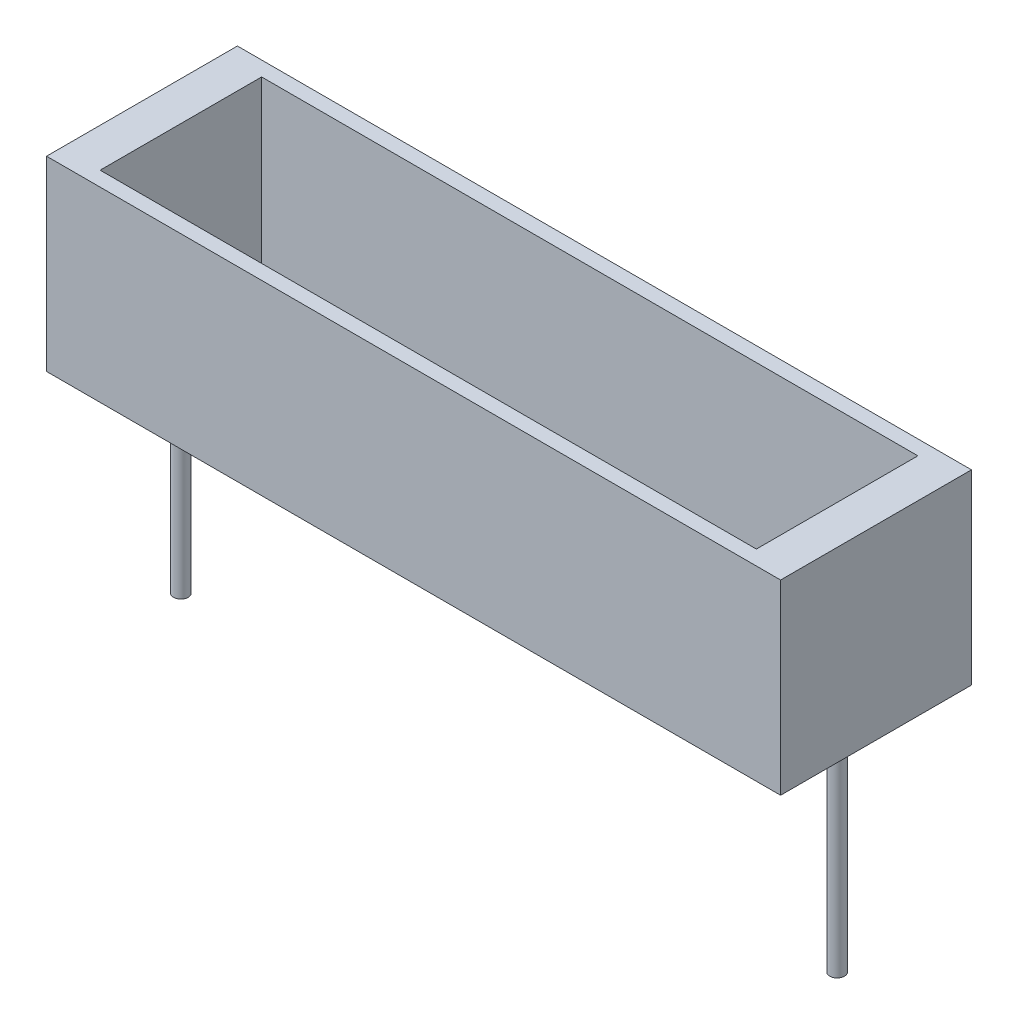
ISO-10303-21;
HEADER;
FILE_DESCRIPTION(('STEP AP214'),'2;1');
FILE_NAME('part.step','',(''),(''),'','','');
FILE_SCHEMA(('AUTOMOTIVE_DESIGN { 1 0 10303 214 1 1 1 1 }'));
ENDSEC;
DATA;
#1=APPLICATION_CONTEXT('core data for automotive mechanical design processes');
#2=APPLICATION_PROTOCOL_DEFINITION('international standard','automotive_design',2000,#1);
#3=PRODUCT_CONTEXT('',#1,'mechanical');
#4=PRODUCT('Part','Part','',(#3));
#5=PRODUCT_RELATED_PRODUCT_CATEGORY('part','',(#4));
#6=PRODUCT_DEFINITION_FORMATION('','',#4);
#7=PRODUCT_DEFINITION_CONTEXT('part definition',#1,'design');
#8=PRODUCT_DEFINITION('design','',#6,#7);
#9=PRODUCT_DEFINITION_SHAPE('','',#8);
#10=(LENGTH_UNIT() NAMED_UNIT(*) SI_UNIT(.MILLI.,.METRE.));
#11=(NAMED_UNIT(*) PLANE_ANGLE_UNIT() SI_UNIT($,.RADIAN.));
#12=(NAMED_UNIT(*) SI_UNIT($,.STERADIAN.) SOLID_ANGLE_UNIT());
#13=UNCERTAINTY_MEASURE_WITH_UNIT(LENGTH_MEASURE(1.E-05),#10,'distance_accuracy_value','');
#14=(GEOMETRIC_REPRESENTATION_CONTEXT(3) GLOBAL_UNCERTAINTY_ASSIGNED_CONTEXT((#13)) GLOBAL_UNIT_ASSIGNED_CONTEXT((#10,
#11,#12)) REPRESENTATION_CONTEXT('',''));
#15=CARTESIAN_POINT('',(0.,0.,0.));
#16=DIRECTION('',(0.,0.,1.));
#17=DIRECTION('',(1.,0.,0.));
#18=AXIS2_PLACEMENT_3D('',#15,#16,#17);
#19=CARTESIAN_POINT('',(-25.,0.,6.5));
#20=DIRECTION('',(0.,1.,0.));
#21=DIRECTION('',(0.,0.,1.));
#22=AXIS2_PLACEMENT_3D('',#19,#20,#21);
#23=PLANE('',#22);
#24=CARTESIAN_POINT('',(-22.35,0.,0.));
#25=DIRECTION('',(0.,1.,0.));
#26=DIRECTION('',(0.,0.,1.));
#27=AXIS2_PLACEMENT_3D('',#24,#25,#26);
#28=CIRCLE('',#27,0.499999999999999);
#29=CARTESIAN_POINT('',(-22.35,0.,0.499999999999999));
#30=VERTEX_POINT('',#29);
#31=EDGE_CURVE('E375',#30,#30,#28,.F.);
#32=ORIENTED_EDGE('',*,*,#31,.F.);
#33=EDGE_LOOP('',(#32));
#34=FACE_BOUND('',#33,.T.);
#35=DIRECTION('',(0.,0.,1.));
#36=VECTOR('',#35,1.);
#37=CARTESIAN_POINT('',(-25.,0.,-6.5));
#38=LINE('',#37,#36);
#39=CARTESIAN_POINT('',(-25.,0.,-6.5));
#40=VERTEX_POINT('',#39);
#41=CARTESIAN_POINT('',(-25.,0.,6.5));
#42=VERTEX_POINT('',#41);
#43=EDGE_CURVE('E470',#40,#42,#38,.T.);
#44=ORIENTED_EDGE('',*,*,#43,.F.);
#45=DIRECTION('',(-1.,0.,0.));
#46=VECTOR('',#45,1.);
#47=CARTESIAN_POINT('',(-25.,0.,-6.5));
#48=LINE('',#47,#46);
#49=CARTESIAN_POINT('',(25.,0.,-6.5));
#50=VERTEX_POINT('',#49);
#51=EDGE_CURVE('E479',#50,#40,#48,.T.);
#52=ORIENTED_EDGE('',*,*,#51,.F.);
#53=DIRECTION('',(0.,0.,-1.));
#54=VECTOR('',#53,1.);
#55=CARTESIAN_POINT('',(25.,0.,-6.5));
#56=LINE('',#55,#54);
#57=CARTESIAN_POINT('',(25.,0.,6.5));
#58=VERTEX_POINT('',#57);
#59=EDGE_CURVE('E477',#58,#50,#56,.T.);
#60=ORIENTED_EDGE('',*,*,#59,.F.);
#61=DIRECTION('',(1.,0.,0.));
#62=VECTOR('',#61,1.);
#63=CARTESIAN_POINT('',(-25.,0.,6.5));
#64=LINE('',#63,#62);
#65=EDGE_CURVE('E475',#42,#58,#64,.T.);
#66=ORIENTED_EDGE('',*,*,#65,.F.);
#67=EDGE_LOOP('',(#44,#52,#60,#66));
#68=FACE_BOUND('',#67,.T.);
#69=CARTESIAN_POINT('',(22.35,0.,0.));
#70=DIRECTION('',(0.,1.,0.));
#71=DIRECTION('',(0.,0.,1.));
#72=AXIS2_PLACEMENT_3D('',#69,#70,#71);
#73=CIRCLE('',#72,0.499999999999999);
#74=CARTESIAN_POINT('',(22.35,0.,0.499999999999999));
#75=VERTEX_POINT('',#74);
#76=EDGE_CURVE('E11',#75,#75,#73,.F.);
#77=ORIENTED_EDGE('',*,*,#76,.F.);
#78=EDGE_LOOP('',(#77));
#79=FACE_BOUND('',#78,.T.);
#80=ADVANCED_FACE('F367',(#34,#68,#79),#23,.F.);
#81=CARTESIAN_POINT('',(-25.,12.7,-6.5));
#82=DIRECTION('',(1.,0.,0.));
#83=DIRECTION('',(0.,0.,-1.));
#84=AXIS2_PLACEMENT_3D('',#81,#82,#83);
#85=PLANE('',#84);
#86=ORIENTED_EDGE('',*,*,#43,.T.);
#87=DIRECTION('',(0.,-1.,0.));
#88=VECTOR('',#87,1.);
#89=CARTESIAN_POINT('',(-25.,12.7,6.5));
#90=LINE('',#89,#88);
#91=CARTESIAN_POINT('',(-25.,12.7,6.5));
#92=VERTEX_POINT('',#91);
#93=EDGE_CURVE('E497',#92,#42,#90,.T.);
#94=ORIENTED_EDGE('',*,*,#93,.F.);
#95=DIRECTION('',(0.,0.,1.));
#96=VECTOR('',#95,1.);
#97=CARTESIAN_POINT('',(-25.,12.7,-6.5));
#98=LINE('',#97,#96);
#99=CARTESIAN_POINT('',(-25.,12.7,-6.5));
#100=VERTEX_POINT('',#99);
#101=EDGE_CURVE('E481',#100,#92,#98,.T.);
#102=ORIENTED_EDGE('',*,*,#101,.F.);
#103=DIRECTION('',(0.,-1.,0.));
#104=VECTOR('',#103,1.);
#105=CARTESIAN_POINT('',(-25.,12.7,-6.5));
#106=LINE('',#105,#104);
#107=EDGE_CURVE('E488',#100,#40,#106,.T.);
#108=ORIENTED_EDGE('',*,*,#107,.T.);
#109=EDGE_LOOP('',(#86,#94,#102,#108));
#110=FACE_BOUND('',#109,.T.);
#111=ADVANCED_FACE('F369',(#110),#85,.F.);
#112=CARTESIAN_POINT('',(-25.,12.7,6.5));
#113=DIRECTION('',(0.,0.,-1.));
#114=DIRECTION('',(-1.,0.,0.));
#115=AXIS2_PLACEMENT_3D('',#112,#113,#114);
#116=PLANE('',#115);
#117=ORIENTED_EDGE('',*,*,#65,.T.);
#118=DIRECTION('',(0.,-1.,0.));
#119=VECTOR('',#118,1.);
#120=CARTESIAN_POINT('',(25.,12.7,6.5));
#121=LINE('',#120,#119);
#122=CARTESIAN_POINT('',(25.,12.7,6.5));
#123=VERTEX_POINT('',#122);
#124=EDGE_CURVE('E494',#123,#58,#121,.T.);
#125=ORIENTED_EDGE('',*,*,#124,.F.);
#126=DIRECTION('',(1.,0.,0.));
#127=VECTOR('',#126,1.);
#128=CARTESIAN_POINT('',(-25.,12.7,6.5));
#129=LINE('',#128,#127);
#130=EDGE_CURVE('E483',#92,#123,#129,.T.);
#131=ORIENTED_EDGE('',*,*,#130,.F.);
#132=ORIENTED_EDGE('',*,*,#93,.T.);
#133=EDGE_LOOP('',(#117,#125,#131,#132));
#134=FACE_BOUND('',#133,.T.);
#135=ADVANCED_FACE('F554',(#134),#116,.F.);
#136=CARTESIAN_POINT('',(25.,12.7,-6.5));
#137=DIRECTION('',(-1.,0.,0.));
#138=DIRECTION('',(0.,0.,1.));
#139=AXIS2_PLACEMENT_3D('',#136,#137,#138);
#140=PLANE('',#139);
#141=ORIENTED_EDGE('',*,*,#59,.T.);
#142=DIRECTION('',(0.,-1.,0.));
#143=VECTOR('',#142,1.);
#144=CARTESIAN_POINT('',(25.,12.7,-6.5));
#145=LINE('',#144,#143);
#146=CARTESIAN_POINT('',(25.,12.7,-6.5));
#147=VERTEX_POINT('',#146);
#148=EDGE_CURVE('E491',#147,#50,#145,.T.);
#149=ORIENTED_EDGE('',*,*,#148,.F.);
#150=DIRECTION('',(0.,0.,-1.));
#151=VECTOR('',#150,1.);
#152=CARTESIAN_POINT('',(25.,12.7,-6.5));
#153=LINE('',#152,#151);
#154=EDGE_CURVE('E485',#123,#147,#153,.T.);
#155=ORIENTED_EDGE('',*,*,#154,.F.);
#156=ORIENTED_EDGE('',*,*,#124,.T.);
#157=EDGE_LOOP('',(#141,#149,#155,#156));
#158=FACE_BOUND('',#157,.T.);
#159=ADVANCED_FACE('F551',(#158),#140,.F.);
#160=CARTESIAN_POINT('',(-25.,12.7,-6.5));
#161=DIRECTION('',(0.,0.,1.));
#162=DIRECTION('',(1.,0.,0.));
#163=AXIS2_PLACEMENT_3D('',#160,#161,#162);
#164=PLANE('',#163);
#165=ORIENTED_EDGE('',*,*,#51,.T.);
#166=ORIENTED_EDGE('',*,*,#107,.F.);
#167=DIRECTION('',(-1.,0.,0.));
#168=VECTOR('',#167,1.);
#169=CARTESIAN_POINT('',(-25.,12.7,-6.5));
#170=LINE('',#169,#168);
#171=EDGE_CURVE('E390',#147,#100,#170,.T.);
#172=ORIENTED_EDGE('',*,*,#171,.F.);
#173=ORIENTED_EDGE('',*,*,#148,.T.);
#174=EDGE_LOOP('',(#165,#166,#172,#173));
#175=FACE_BOUND('',#174,.T.);
#176=ADVANCED_FACE('F548',(#175),#164,.F.);
#177=CARTESIAN_POINT('',(-25.,12.7,6.5));
#178=DIRECTION('',(0.,1.,0.));
#179=DIRECTION('',(0.,0.,1.));
#180=AXIS2_PLACEMENT_3D('',#177,#178,#179);
#181=PLANE('',#180);
#182=DIRECTION('',(0.,0.,-1.));
#183=VECTOR('',#182,1.);
#184=CARTESIAN_POINT('',(22.35,12.7,-5.5));
#185=LINE('',#184,#183);
#186=CARTESIAN_POINT('',(22.35,12.7,5.5));
#187=VERTEX_POINT('',#186);
#188=CARTESIAN_POINT('',(22.35,12.7,-5.5));
#189=VERTEX_POINT('',#188);
#190=EDGE_CURVE('E382',#187,#189,#185,.T.);
#191=ORIENTED_EDGE('',*,*,#190,.F.);
#192=DIRECTION('',(1.,0.,0.));
#193=VECTOR('',#192,1.);
#194=CARTESIAN_POINT('',(22.35,12.7,5.5));
#195=LINE('',#194,#193);
#196=CARTESIAN_POINT('',(-22.35,12.7,5.5));
#197=VERTEX_POINT('',#196);
#198=EDGE_CURVE('E454',#197,#187,#195,.T.);
#199=ORIENTED_EDGE('',*,*,#198,.F.);
#200=DIRECTION('',(0.,0.,1.));
#201=VECTOR('',#200,1.);
#202=CARTESIAN_POINT('',(-22.35,12.7,-5.5));
#203=LINE('',#202,#201);
#204=CARTESIAN_POINT('',(-22.35,12.7,-5.5));
#205=VERTEX_POINT('',#204);
#206=EDGE_CURVE('E437',#205,#197,#203,.T.);
#207=ORIENTED_EDGE('',*,*,#206,.F.);
#208=DIRECTION('',(-1.,0.,0.));
#209=VECTOR('',#208,1.);
#210=CARTESIAN_POINT('',(22.35,12.7,-5.5));
#211=LINE('',#210,#209);
#212=EDGE_CURVE('E448',#189,#205,#211,.T.);
#213=ORIENTED_EDGE('',*,*,#212,.F.);
#214=EDGE_LOOP('',(#191,#199,#207,#213));
#215=FACE_BOUND('',#214,.T.);
#216=ORIENTED_EDGE('',*,*,#101,.T.);
#217=ORIENTED_EDGE('',*,*,#130,.T.);
#218=ORIENTED_EDGE('',*,*,#154,.T.);
#219=ORIENTED_EDGE('',*,*,#171,.T.);
#220=EDGE_LOOP('',(#216,#217,#218,#219));
#221=FACE_BOUND('',#220,.T.);
#222=ADVANCED_FACE('F452',(#215,#221),#181,.T.);
#223=CARTESIAN_POINT('',(22.35,1.7,-5.5));
#224=DIRECTION('',(1.,0.,0.));
#225=DIRECTION('',(0.,0.,-1.));
#226=AXIS2_PLACEMENT_3D('',#223,#224,#225);
#227=PLANE('',#226);
#228=ORIENTED_EDGE('',*,*,#190,.T.);
#229=DIRECTION('',(0.,1.,0.));
#230=VECTOR('',#229,1.);
#231=CARTESIAN_POINT('',(22.35,1.7,-5.5));
#232=LINE('',#231,#230);
#233=CARTESIAN_POINT('',(22.35,1.7,-5.5));
#234=VERTEX_POINT('',#233);
#235=EDGE_CURVE('E445',#234,#189,#232,.T.);
#236=ORIENTED_EDGE('',*,*,#235,.F.);
#237=DIRECTION('',(0.,0.,-1.));
#238=VECTOR('',#237,1.);
#239=CARTESIAN_POINT('',(22.35,1.7,-5.5));
#240=LINE('',#239,#238);
#241=CARTESIAN_POINT('',(22.35,1.7,5.5));
#242=VERTEX_POINT('',#241);
#243=EDGE_CURVE('E456',#242,#234,#240,.T.);
#244=ORIENTED_EDGE('',*,*,#243,.F.);
#245=DIRECTION('',(0.,1.,0.));
#246=VECTOR('',#245,1.);
#247=CARTESIAN_POINT('',(22.35,1.7,5.5));
#248=LINE('',#247,#246);
#249=EDGE_CURVE('E468',#242,#187,#248,.T.);
#250=ORIENTED_EDGE('',*,*,#249,.T.);
#251=EDGE_LOOP('',(#228,#236,#244,#250));
#252=FACE_BOUND('',#251,.T.);
#253=ADVANCED_FACE('F538',(#252),#227,.F.);
#254=CARTESIAN_POINT('',(22.35,1.7,5.5));
#255=DIRECTION('',(0.,0.,1.));
#256=DIRECTION('',(1.,0.,0.));
#257=AXIS2_PLACEMENT_3D('',#254,#255,#256);
#258=PLANE('',#257);
#259=ORIENTED_EDGE('',*,*,#198,.T.);
#260=ORIENTED_EDGE('',*,*,#249,.F.);
#261=DIRECTION('',(1.,0.,0.));
#262=VECTOR('',#261,1.);
#263=CARTESIAN_POINT('',(22.35,1.7,5.5));
#264=LINE('',#263,#262);
#265=CARTESIAN_POINT('',(-22.35,1.7,5.5));
#266=VERTEX_POINT('',#265);
#267=EDGE_CURVE('E465',#266,#242,#264,.T.);
#268=ORIENTED_EDGE('',*,*,#267,.F.);
#269=DIRECTION('',(0.,1.,0.));
#270=VECTOR('',#269,1.);
#271=CARTESIAN_POINT('',(-22.35,1.7,5.5));
#272=LINE('',#271,#270);
#273=EDGE_CURVE('E444',#266,#197,#272,.T.);
#274=ORIENTED_EDGE('',*,*,#273,.T.);
#275=EDGE_LOOP('',(#259,#260,#268,#274));
#276=FACE_BOUND('',#275,.T.);
#277=ADVANCED_FACE('F535',(#276),#258,.F.);
#278=CARTESIAN_POINT('',(-22.35,1.7,-5.5));
#279=DIRECTION('',(-1.,0.,0.));
#280=DIRECTION('',(0.,0.,1.));
#281=AXIS2_PLACEMENT_3D('',#278,#279,#280);
#282=PLANE('',#281);
#283=ORIENTED_EDGE('',*,*,#206,.T.);
#284=ORIENTED_EDGE('',*,*,#273,.F.);
#285=DIRECTION('',(0.,0.,1.));
#286=VECTOR('',#285,1.);
#287=CARTESIAN_POINT('',(-22.35,1.7,-5.5));
#288=LINE('',#287,#286);
#289=CARTESIAN_POINT('',(-22.35,1.7,-5.5));
#290=VERTEX_POINT('',#289);
#291=EDGE_CURVE('E440',#290,#266,#288,.T.);
#292=ORIENTED_EDGE('',*,*,#291,.F.);
#293=DIRECTION('',(0.,1.,0.));
#294=VECTOR('',#293,1.);
#295=CARTESIAN_POINT('',(-22.35,1.7,-5.5));
#296=LINE('',#295,#294);
#297=EDGE_CURVE('E433',#290,#205,#296,.T.);
#298=ORIENTED_EDGE('',*,*,#297,.T.);
#299=EDGE_LOOP('',(#283,#284,#292,#298));
#300=FACE_BOUND('',#299,.T.);
#301=ADVANCED_FACE('F435',(#300),#282,.F.);
#302=CARTESIAN_POINT('',(22.35,1.7,-5.5));
#303=DIRECTION('',(0.,0.,-1.));
#304=DIRECTION('',(-1.,0.,0.));
#305=AXIS2_PLACEMENT_3D('',#302,#303,#304);
#306=PLANE('',#305);
#307=ORIENTED_EDGE('',*,*,#212,.T.);
#308=ORIENTED_EDGE('',*,*,#297,.F.);
#309=DIRECTION('',(-1.,0.,0.));
#310=VECTOR('',#309,1.);
#311=CARTESIAN_POINT('',(22.35,1.7,-5.5));
#312=LINE('',#311,#310);
#313=EDGE_CURVE('E462',#234,#290,#312,.T.);
#314=ORIENTED_EDGE('',*,*,#313,.F.);
#315=ORIENTED_EDGE('',*,*,#235,.T.);
#316=EDGE_LOOP('',(#307,#308,#314,#315));
#317=FACE_BOUND('',#316,.T.);
#318=ADVANCED_FACE('F449',(#317),#306,.F.);
#319=CARTESIAN_POINT('',(22.35,1.7,5.5));
#320=DIRECTION('',(0.,-1.,0.));
#321=DIRECTION('',(0.,0.,-1.));
#322=AXIS2_PLACEMENT_3D('',#319,#320,#321);
#323=PLANE('',#322);
#324=ORIENTED_EDGE('',*,*,#243,.T.);
#325=ORIENTED_EDGE('',*,*,#313,.T.);
#326=ORIENTED_EDGE('',*,*,#291,.T.);
#327=ORIENTED_EDGE('',*,*,#267,.T.);
#328=EDGE_LOOP('',(#324,#325,#326,#327));
#329=FACE_BOUND('',#328,.T.);
#330=ADVANCED_FACE('F530',(#329),#323,.F.);
#331=CARTESIAN_POINT('',(-22.35,-15.,0.));
#332=DIRECTION('',(0.,1.,0.));
#333=DIRECTION('',(0.,0.,1.));
#334=AXIS2_PLACEMENT_3D('',#331,#332,#333);
#335=CYLINDRICAL_SURFACE('',#334,0.499999999999999);
#336=CARTESIAN_POINT('',(-22.35,-15.,0.));
#337=DIRECTION('',(0.,-1.,0.));
#338=DIRECTION('',(0.,0.,-1.));
#339=AXIS2_PLACEMENT_3D('',#336,#337,#338);
#340=CIRCLE('',#339,0.499999999999999);
#341=CARTESIAN_POINT('',(-22.35,-15.,-0.499999999999999));
#342=VERTEX_POINT('',#341);
#343=EDGE_CURVE('E626',#342,#342,#340,.T.);
#344=ORIENTED_EDGE('',*,*,#343,.F.);
#345=EDGE_LOOP('',(#344));
#346=FACE_BOUND('',#345,.T.);
#347=ORIENTED_EDGE('',*,*,#31,.T.);
#348=EDGE_LOOP('',(#347));
#349=FACE_BOUND('',#348,.T.);
#350=ADVANCED_FACE('F502',(#346,#349),#335,.T.);
#351=CARTESIAN_POINT('',(-22.35,-15.,0.));
#352=DIRECTION('',(0.,-1.,0.));
#353=DIRECTION('',(0.,0.,-1.));
#354=AXIS2_PLACEMENT_3D('',#351,#352,#353);
#355=PLANE('',#354);
#356=ORIENTED_EDGE('',*,*,#343,.T.);
#357=EDGE_LOOP('',(#356));
#358=FACE_BOUND('',#357,.T.);
#359=ADVANCED_FACE('F515',(#358),#355,.T.);
#360=CARTESIAN_POINT('',(22.35,-15.,0.));
#361=DIRECTION('',(0.,1.,0.));
#362=DIRECTION('',(0.,0.,1.));
#363=AXIS2_PLACEMENT_3D('',#360,#361,#362);
#364=CYLINDRICAL_SURFACE('',#363,0.499999999999999);
#365=CARTESIAN_POINT('',(22.35,-15.,0.));
#366=DIRECTION('',(0.,-1.,0.));
#367=DIRECTION('',(0.,0.,-1.));
#368=AXIS2_PLACEMENT_3D('',#365,#366,#367);
#369=CIRCLE('',#368,0.499999999999999);
#370=CARTESIAN_POINT('',(22.35,-15.,-0.499999999999999));
#371=VERTEX_POINT('',#370);
#372=EDGE_CURVE('E628',#371,#371,#369,.T.);
#373=ORIENTED_EDGE('',*,*,#372,.F.);
#374=EDGE_LOOP('',(#373));
#375=FACE_BOUND('',#374,.T.);
#376=ORIENTED_EDGE('',*,*,#76,.T.);
#377=EDGE_LOOP('',(#376));
#378=FACE_BOUND('',#377,.T.);
#379=ADVANCED_FACE('F512',(#375,#378),#364,.T.);
#380=CARTESIAN_POINT('',(22.35,-15.,0.));
#381=DIRECTION('',(0.,-1.,0.));
#382=DIRECTION('',(0.,0.,-1.));
#383=AXIS2_PLACEMENT_3D('',#380,#381,#382);
#384=PLANE('',#383);
#385=ORIENTED_EDGE('',*,*,#372,.T.);
#386=EDGE_LOOP('',(#385));
#387=FACE_BOUND('',#386,.T.);
#388=ADVANCED_FACE('F514',(#387),#384,.T.);
#389=CLOSED_SHELL('',(#80,#111,#135,#159,#176,#222,#253,#277,#301,#318,#330,#350,#359,#379,#388));
#390=MANIFOLD_SOLID_BREP('B2',#389);
#391=ADVANCED_BREP_SHAPE_REPRESENTATION('',(#18,#390),#14);
#392=SHAPE_DEFINITION_REPRESENTATION(#9,#391);
ENDSEC;
END-ISO-10303-21;
